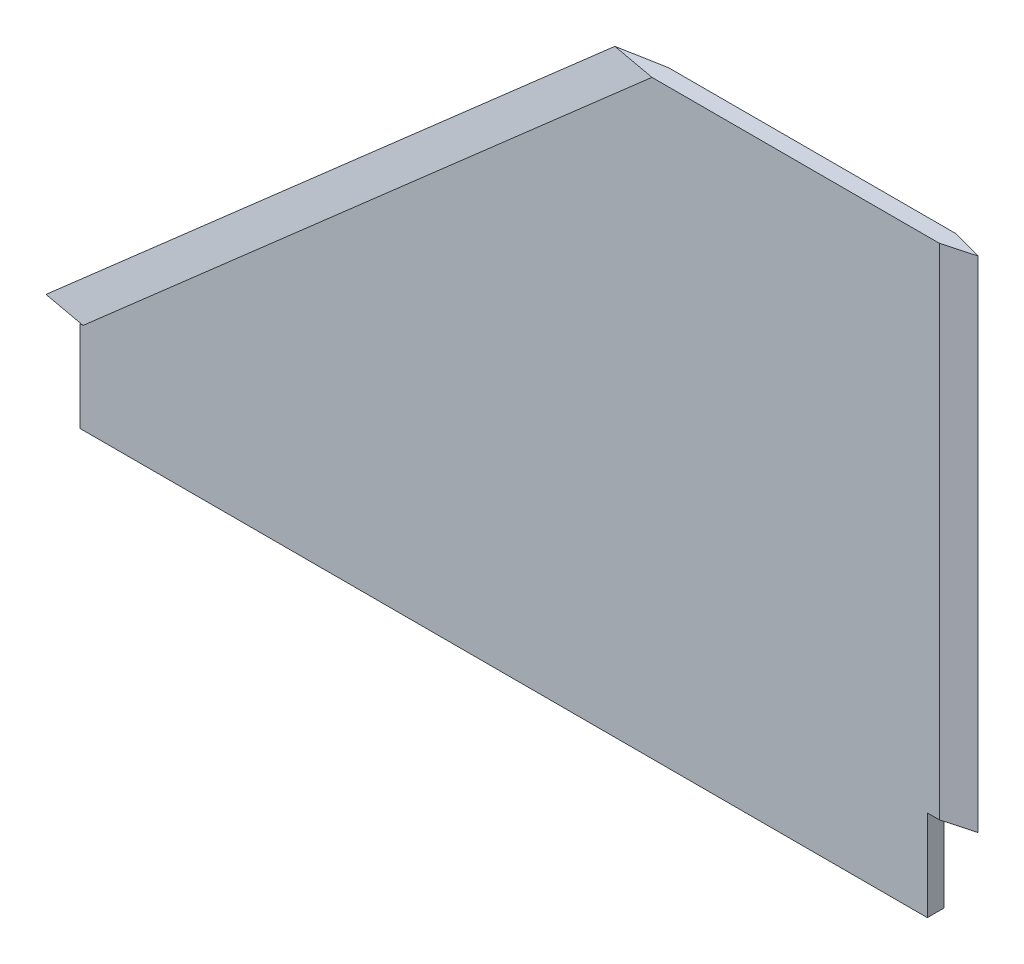
ISO-10303-21;
HEADER;
FILE_DESCRIPTION(('STEP AP214'),'2;1');
FILE_NAME('part.step','',(''),(''),'','','');
FILE_SCHEMA(('AUTOMOTIVE_DESIGN { 1 0 10303 214 1 1 1 1 }'));
ENDSEC;
DATA;
#1=APPLICATION_CONTEXT('core data for automotive mechanical design processes');
#2=APPLICATION_PROTOCOL_DEFINITION('international standard','automotive_design',2000,#1);
#3=PRODUCT_CONTEXT('',#1,'mechanical');
#4=PRODUCT('Part','Part','',(#3));
#5=PRODUCT_RELATED_PRODUCT_CATEGORY('part','',(#4));
#6=PRODUCT_DEFINITION_FORMATION('','',#4);
#7=PRODUCT_DEFINITION_CONTEXT('part definition',#1,'design');
#8=PRODUCT_DEFINITION('design','',#6,#7);
#9=PRODUCT_DEFINITION_SHAPE('','',#8);
#10=(LENGTH_UNIT() NAMED_UNIT(*) SI_UNIT(.MILLI.,.METRE.));
#11=(NAMED_UNIT(*) PLANE_ANGLE_UNIT() SI_UNIT($,.RADIAN.));
#12=(NAMED_UNIT(*) SI_UNIT($,.STERADIAN.) SOLID_ANGLE_UNIT());
#13=UNCERTAINTY_MEASURE_WITH_UNIT(LENGTH_MEASURE(1.E-05),#10,'distance_accuracy_value','');
#14=(GEOMETRIC_REPRESENTATION_CONTEXT(3) GLOBAL_UNCERTAINTY_ASSIGNED_CONTEXT((#13)) GLOBAL_UNIT_ASSIGNED_CONTEXT((#10,
#11,#12)) REPRESENTATION_CONTEXT('',''));
#15=CARTESIAN_POINT('',(0.,0.,0.));
#16=DIRECTION('',(0.,0.,1.));
#17=DIRECTION('',(1.,0.,0.));
#18=AXIS2_PLACEMENT_3D('',#15,#16,#17);
#19=CARTESIAN_POINT('',(0.,165.,-2.75));
#20=DIRECTION('',(0.,-1.,0.));
#21=DIRECTION('',(0.,0.,-1.));
#22=AXIS2_PLACEMENT_3D('',#19,#20,#21);
#23=PLANE('',#22);
#24=DIRECTION('',(-0.964205392803791,0.,-0.265156483021042));
#25=VECTOR('',#24,1.);
#26=CARTESIAN_POINT('',(10.8274259151657,165.,-39.3724578733294));
#27=LINE('',#26,#25);
#28=CARTESIAN_POINT('',(154.,165.,0.));
#29=VERTEX_POINT('',#28);
#30=CARTESIAN_POINT('',(144.,165.,-2.75));
#31=VERTEX_POINT('',#30);
#32=EDGE_CURVE('E141',#29,#31,#27,.T.);
#33=ORIENTED_EDGE('',*,*,#32,.T.);
#34=DIRECTION('',(1.,0.,0.));
#35=VECTOR('',#34,1.);
#36=CARTESIAN_POINT('',(0.,165.,-2.75));
#37=LINE('',#36,#35);
#38=CARTESIAN_POINT('',(49.,165.,-2.75));
#39=VERTEX_POINT('',#38);
#40=EDGE_CURVE('E153',#39,#31,#37,.T.);
#41=ORIENTED_EDGE('',*,*,#40,.F.);
#42=DIRECTION('',(-0.983606557377049,0.,0.180327868852459));
#43=VECTOR('',#42,1.);
#44=CARTESIAN_POINT('',(1.10561676968568,165.,6.03063692555762));
#45=LINE('',#44,#43);
#46=CARTESIAN_POINT('',(34.,165.,0.));
#47=VERTEX_POINT('',#46);
#48=EDGE_CURVE('E238',#39,#47,#45,.T.);
#49=ORIENTED_EDGE('',*,*,#48,.T.);
#50=DIRECTION('',(0.983606557377049,0.,0.180327868852459));
#51=VECTOR('',#50,1.);
#52=CARTESIAN_POINT('',(1.10561676968568,165.,-6.03063692555763));
#53=LINE('',#52,#51);
#54=CARTESIAN_POINT('',(49.,165.,2.75));
#55=VERTEX_POINT('',#54);
#56=EDGE_CURVE('E245',#47,#55,#53,.T.);
#57=ORIENTED_EDGE('',*,*,#56,.T.);
#58=DIRECTION('',(1.,0.,0.));
#59=VECTOR('',#58,1.);
#60=CARTESIAN_POINT('',(0.,165.,2.75));
#61=LINE('',#60,#59);
#62=CARTESIAN_POINT('',(144.,165.,2.75));
#63=VERTEX_POINT('',#62);
#64=EDGE_CURVE('E221',#55,#63,#61,.T.);
#65=ORIENTED_EDGE('',*,*,#64,.T.);
#66=DIRECTION('',(0.964205392803791,0.,-0.265156483021042));
#67=VECTOR('',#66,1.);
#68=CARTESIAN_POINT('',(10.8274259151657,165.,39.3724578733293));
#69=LINE('',#68,#67);
#70=EDGE_CURVE('E155',#63,#29,#69,.T.);
#71=ORIENTED_EDGE('',*,*,#70,.T.);
#72=EDGE_LOOP('',(#33,#41,#49,#57,#65,#71));
#73=FACE_BOUND('',#72,.T.);
#74=ADVANCED_FACE('F56',(#73),#23,.F.);
#75=CARTESIAN_POINT('',(0.,0.,-2.75));
#76=DIRECTION('',(0.,1.,0.));
#77=DIRECTION('',(0.,0.,1.));
#78=AXIS2_PLACEMENT_3D('',#75,#76,#77);
#79=PLANE('',#78);
#80=DIRECTION('',(0.96420539280379,0.,0.265156483021042));
#81=VECTOR('',#80,1.);
#82=CARTESIAN_POINT('',(10.8274259151655,1.94289029309402E-13,-39.3724578733294));
#83=LINE('',#82,#81);
#84=CARTESIAN_POINT('',(144.,0.,-2.75));
#85=VERTEX_POINT('',#84);
#86=CARTESIAN_POINT('',(154.,2.63677968348475E-13,0.));
#87=VERTEX_POINT('',#86);
#88=EDGE_CURVE('E144',#85,#87,#83,.T.);
#89=ORIENTED_EDGE('',*,*,#88,.T.);
#90=DIRECTION('',(-0.96420539280379,0.,0.265156483021042));
#91=VECTOR('',#90,1.);
#92=CARTESIAN_POINT('',(10.8274259151655,1.66533453693773E-13,39.3724578733293));
#93=LINE('',#92,#91);
#94=CARTESIAN_POINT('',(144.,0.,2.75));
#95=VERTEX_POINT('',#94);
#96=EDGE_CURVE('E240',#87,#95,#93,.T.);
#97=ORIENTED_EDGE('',*,*,#96,.T.);
#98=DIRECTION('',(-1.,0.,0.));
#99=VECTOR('',#98,1.);
#100=CARTESIAN_POINT('',(0.,0.,2.75));
#101=LINE('',#100,#99);
#102=CARTESIAN_POINT('',(140.,0.,2.74999999999999));
#103=VERTEX_POINT('',#102);
#104=EDGE_CURVE('E215',#95,#103,#101,.T.);
#105=ORIENTED_EDGE('',*,*,#104,.T.);
#106=DIRECTION('',(0.,0.,1.));
#107=VECTOR('',#106,1.);
#108=CARTESIAN_POINT('',(140.,0.,-2.75));
#109=LINE('',#108,#107);
#110=CARTESIAN_POINT('',(140.,0.,-2.75));
#111=VERTEX_POINT('',#110);
#112=EDGE_CURVE('E174',#111,#103,#109,.T.);
#113=ORIENTED_EDGE('',*,*,#112,.F.);
#114=DIRECTION('',(-1.,0.,0.));
#115=VECTOR('',#114,1.);
#116=CARTESIAN_POINT('',(0.,0.,-2.75));
#117=LINE('',#116,#115);
#118=EDGE_CURVE('E163',#85,#111,#117,.T.);
#119=ORIENTED_EDGE('',*,*,#118,.F.);
#120=EDGE_LOOP('',(#89,#97,#105,#113,#119));
#121=FACE_BOUND('',#120,.T.);
#122=ADVANCED_FACE('F258',(#121),#79,.F.);
#123=CARTESIAN_POINT('',(0.,0.,-2.75));
#124=DIRECTION('',(0.,0.,1.));
#125=DIRECTION('',(1.,0.,0.));
#126=AXIS2_PLACEMENT_3D('',#123,#124,#125);
#127=PLANE('',#126);
#128=DIRECTION('',(0.,1.,0.));
#129=VECTOR('',#128,1.);
#130=CARTESIAN_POINT('',(143.999999999998,-10.3712342563457,-2.75));
#131=LINE('',#130,#129);
#132=EDGE_CURVE('E138',#85,#31,#131,.T.);
#133=ORIENTED_EDGE('',*,*,#132,.F.);
#134=ORIENTED_EDGE('',*,*,#118,.T.);
#135=DIRECTION('',(0.,1.,0.));
#136=VECTOR('',#135,1.);
#137=CARTESIAN_POINT('',(140.,0.,-2.75));
#138=LINE('',#137,#136);
#139=CARTESIAN_POINT('',(140.,-30.,-2.75));
#140=VERTEX_POINT('',#139);
#141=EDGE_CURVE('E168',#140,#111,#138,.T.);
#142=ORIENTED_EDGE('',*,*,#141,.F.);
#143=DIRECTION('',(1.,0.,0.));
#144=VECTOR('',#143,1.);
#145=CARTESIAN_POINT('',(0.,-30.,-2.75));
#146=LINE('',#145,#144);
#147=CARTESIAN_POINT('',(-140.000000000001,-30.,-2.75));
#148=VERTEX_POINT('',#147);
#149=EDGE_CURVE('E166',#148,#140,#146,.T.);
#150=ORIENTED_EDGE('',*,*,#149,.F.);
#151=DIRECTION('',(0.,1.,0.));
#152=VECTOR('',#151,1.);
#153=CARTESIAN_POINT('',(-140.000000000001,0.,-2.75));
#154=LINE('',#153,#152);
#155=CARTESIAN_POINT('',(-140.000000000001,0.,-2.75));
#156=VERTEX_POINT('',#155);
#157=EDGE_CURVE('E162',#148,#156,#154,.T.);
#158=ORIENTED_EDGE('',*,*,#157,.T.);
#159=DIRECTION('',(-1.,0.,0.));
#160=VECTOR('',#159,1.);
#161=CARTESIAN_POINT('',(0.,0.,-2.75));
#162=LINE('',#161,#160);
#163=CARTESIAN_POINT('',(-139.000000000001,0.,-2.75));
#164=VERTEX_POINT('',#163);
#165=EDGE_CURVE('E12',#164,#156,#162,.T.);
#166=ORIENTED_EDGE('',*,*,#165,.F.);
#167=DIRECTION('',(0.751585239390208,0.659635981379703,0.));
#168=VECTOR('',#167,1.);
#169=CARTESIAN_POINT('',(-153.41871623823,-12.6547243580201,-2.75));
#170=LINE('',#169,#168);
#171=EDGE_CURVE('E161',#164,#39,#170,.T.);
#172=ORIENTED_EDGE('',*,*,#171,.T.);
#173=ORIENTED_EDGE('',*,*,#40,.T.);
#174=EDGE_LOOP('',(#133,#134,#142,#150,#158,#166,#172,#173));
#175=FACE_BOUND('',#174,.T.);
#176=ADVANCED_FACE('F158',(#175),#127,.F.);
#177=CARTESIAN_POINT('',(0.,0.,2.75));
#178=DIRECTION('',(0.,0.,1.));
#179=DIRECTION('',(1.,0.,0.));
#180=AXIS2_PLACEMENT_3D('',#177,#178,#179);
#181=PLANE('',#180);
#182=ORIENTED_EDGE('',*,*,#104,.F.);
#183=DIRECTION('',(0.,1.,0.));
#184=VECTOR('',#183,1.);
#185=CARTESIAN_POINT('',(143.999999999998,-10.3712342563458,2.75));
#186=LINE('',#185,#184);
#187=EDGE_CURVE('E71',#95,#63,#186,.T.);
#188=ORIENTED_EDGE('',*,*,#187,.T.);
#189=ORIENTED_EDGE('',*,*,#64,.F.);
#190=DIRECTION('',(0.751585239390208,0.659635981379703,0.));
#191=VECTOR('',#190,1.);
#192=CARTESIAN_POINT('',(-153.41871623823,-12.6547243580201,2.75));
#193=LINE('',#192,#191);
#194=CARTESIAN_POINT('',(-139.000000000001,0.,2.75));
#195=VERTEX_POINT('',#194);
#196=EDGE_CURVE('E243',#195,#55,#193,.T.);
#197=ORIENTED_EDGE('',*,*,#196,.F.);
#198=DIRECTION('',(-1.,0.,0.));
#199=VECTOR('',#198,1.);
#200=CARTESIAN_POINT('',(-202.41871623823,0.,2.75));
#201=LINE('',#200,#199);
#202=CARTESIAN_POINT('',(-140.000000000001,0.,2.75));
#203=VERTEX_POINT('',#202);
#204=EDGE_CURVE('E202',#195,#203,#201,.T.);
#205=ORIENTED_EDGE('',*,*,#204,.T.);
#206=DIRECTION('',(0.,1.,0.));
#207=VECTOR('',#206,1.);
#208=CARTESIAN_POINT('',(-140.000000000001,0.,2.75));
#209=LINE('',#208,#207);
#210=CARTESIAN_POINT('',(-140.000000000001,-30.,2.75));
#211=VERTEX_POINT('',#210);
#212=EDGE_CURVE('E212',#211,#203,#209,.T.);
#213=ORIENTED_EDGE('',*,*,#212,.F.);
#214=DIRECTION('',(1.,0.,0.));
#215=VECTOR('',#214,1.);
#216=CARTESIAN_POINT('',(0.,-30.,2.75));
#217=LINE('',#216,#215);
#218=CARTESIAN_POINT('',(140.,-30.,2.75));
#219=VERTEX_POINT('',#218);
#220=EDGE_CURVE('E224',#211,#219,#217,.T.);
#221=ORIENTED_EDGE('',*,*,#220,.T.);
#222=DIRECTION('',(0.,1.,0.));
#223=VECTOR('',#222,1.);
#224=CARTESIAN_POINT('',(140.,0.,2.74999999999999));
#225=LINE('',#224,#223);
#226=EDGE_CURVE('E213',#219,#103,#225,.T.);
#227=ORIENTED_EDGE('',*,*,#226,.T.);
#228=EDGE_LOOP('',(#182,#188,#189,#197,#205,#213,#221,#227));
#229=FACE_BOUND('',#228,.T.);
#230=ADVANCED_FACE('F250',(#229),#181,.T.);
#231=DIRECTION('',(0.983606557377049,0.,-0.180327868852459));
#232=VECTOR('',#231,1.);
#233=CARTESIAN_POINT('',(-200.844229631182,0.,8.58810876571651));
#234=LINE('',#233,#232);
#235=CARTESIAN_POINT('',(-154.000000000001,0.,0.));
#236=VERTEX_POINT('',#235);
#237=CARTESIAN_POINT('',(-140.000000000001,0.,-2.56666666666666));
#238=VERTEX_POINT('',#237);
#239=EDGE_CURVE('E190',#236,#238,#234,.T.);
#240=ORIENTED_EDGE('',*,*,#239,.T.);
#241=DIRECTION('',(0.,0.,1.));
#242=VECTOR('',#241,1.);
#243=CARTESIAN_POINT('',(-140.000000000001,0.,-2.75));
#244=LINE('',#243,#242);
#245=CARTESIAN_POINT('',(-140.000000000001,0.,2.56666666666667));
#246=VERTEX_POINT('',#245);
#247=EDGE_CURVE('E179',#238,#246,#244,.T.);
#248=ORIENTED_EDGE('',*,*,#247,.T.);
#249=DIRECTION('',(-0.983606557377049,0.,-0.180327868852459));
#250=VECTOR('',#249,1.);
#251=CARTESIAN_POINT('',(-200.844229631182,0.,-8.58810876571651));
#252=LINE('',#251,#250);
#253=EDGE_CURVE('E189',#246,#236,#252,.T.);
#254=ORIENTED_EDGE('',*,*,#253,.T.);
#255=EDGE_LOOP('',(#240,#248,#254));
#256=FACE_BOUND('',#255,.T.);
#257=ADVANCED_FACE('F188',(#256),#79,.F.);
#258=CARTESIAN_POINT('',(140.,0.,-2.75));
#259=DIRECTION('',(1.,0.,0.));
#260=DIRECTION('',(0.,0.,-1.));
#261=AXIS2_PLACEMENT_3D('',#258,#259,#260);
#262=PLANE('',#261);
#263=ORIENTED_EDGE('',*,*,#112,.T.);
#264=ORIENTED_EDGE('',*,*,#226,.F.);
#265=DIRECTION('',(0.,0.,1.));
#266=VECTOR('',#265,1.);
#267=CARTESIAN_POINT('',(140.,-30.,-2.75));
#268=LINE('',#267,#266);
#269=EDGE_CURVE('E64',#140,#219,#268,.T.);
#270=ORIENTED_EDGE('',*,*,#269,.F.);
#271=ORIENTED_EDGE('',*,*,#141,.T.);
#272=EDGE_LOOP('',(#263,#264,#270,#271));
#273=FACE_BOUND('',#272,.T.);
#274=ADVANCED_FACE('F58',(#273),#262,.T.);
#275=CARTESIAN_POINT('',(0.,-30.,-2.75));
#276=DIRECTION('',(0.,-1.,0.));
#277=DIRECTION('',(0.,0.,-1.));
#278=AXIS2_PLACEMENT_3D('',#275,#276,#277);
#279=PLANE('',#278);
#280=ORIENTED_EDGE('',*,*,#269,.T.);
#281=ORIENTED_EDGE('',*,*,#220,.F.);
#282=DIRECTION('',(0.,0.,1.));
#283=VECTOR('',#282,1.);
#284=CARTESIAN_POINT('',(-140.000000000001,-30.,-2.75));
#285=LINE('',#284,#283);
#286=EDGE_CURVE('E176',#148,#211,#285,.T.);
#287=ORIENTED_EDGE('',*,*,#286,.F.);
#288=ORIENTED_EDGE('',*,*,#149,.T.);
#289=EDGE_LOOP('',(#280,#281,#287,#288));
#290=FACE_BOUND('',#289,.T.);
#291=ADVANCED_FACE('F228',(#290),#279,.T.);
#292=CARTESIAN_POINT('',(-140.000000000001,0.,-2.75));
#293=DIRECTION('',(1.,0.,0.));
#294=DIRECTION('',(0.,0.,-1.));
#295=AXIS2_PLACEMENT_3D('',#292,#293,#294);
#296=PLANE('',#295);
#297=ORIENTED_EDGE('',*,*,#286,.T.);
#298=ORIENTED_EDGE('',*,*,#212,.T.);
#299=DIRECTION('',(0.,0.,1.));
#300=VECTOR('',#299,1.);
#301=CARTESIAN_POINT('',(-140.000000000001,0.,-2.75));
#302=LINE('',#301,#300);
#303=EDGE_CURVE('E206',#246,#203,#302,.T.);
#304=ORIENTED_EDGE('',*,*,#303,.F.);
#305=ORIENTED_EDGE('',*,*,#247,.F.);
#306=EDGE_CURVE('E178',#156,#238,#244,.T.);
#307=ORIENTED_EDGE('',*,*,#306,.F.);
#308=ORIENTED_EDGE('',*,*,#157,.F.);
#309=EDGE_LOOP('',(#297,#298,#304,#305,#307,#308));
#310=FACE_BOUND('',#309,.T.);
#311=ADVANCED_FACE('F210',(#310),#296,.F.);
#312=CARTESIAN_POINT('',(0.,0.,-2.75));
#313=DIRECTION('',(0.,1.,0.));
#314=DIRECTION('',(0.,0.,1.));
#315=AXIS2_PLACEMENT_3D('',#312,#313,#314);
#316=PLANE('',#315);
#317=ORIENTED_EDGE('',*,*,#303,.T.);
#318=ORIENTED_EDGE('',*,*,#204,.F.);
#319=EDGE_CURVE('E198',#195,#246,#252,.T.);
#320=ORIENTED_EDGE('',*,*,#319,.T.);
#321=EDGE_LOOP('',(#317,#318,#320));
#322=FACE_BOUND('',#321,.T.);
#323=ADVANCED_FACE('F205',(#322),#316,.T.);
#324=CARTESIAN_POINT('',(-201.313099468544,-12.6547243580199,-6.03063692555762));
#325=DIRECTION('',(-0.176637965698435,0.201260227583671,0.963479812900555));
#326=DIRECTION('',(0.,-0.978871698447465,0.20447542145347));
#327=AXIS2_PLACEMENT_3D('',#324,#325,#326);
#328=PLANE('',#327);
#329=ORIENTED_EDGE('',*,*,#196,.T.);
#330=ORIENTED_EDGE('',*,*,#56,.F.);
#331=DIRECTION('',(0.751585239390208,0.659635981379703,0.));
#332=VECTOR('',#331,1.);
#333=CARTESIAN_POINT('',(-168.41871623823,-12.6547243580202,0.));
#334=LINE('',#333,#332);
#335=EDGE_CURVE('E201',#236,#47,#334,.T.);
#336=ORIENTED_EDGE('',*,*,#335,.F.);
#337=ORIENTED_EDGE('',*,*,#253,.F.);
#338=ORIENTED_EDGE('',*,*,#319,.F.);
#339=EDGE_LOOP('',(#329,#330,#336,#337,#338));
#340=FACE_BOUND('',#339,.T.);
#341=ADVANCED_FACE('F197',(#340),#328,.T.);
#342=CARTESIAN_POINT('',(0.,0.,-2.75));
#343=DIRECTION('',(0.,1.,0.));
#344=DIRECTION('',(0.,0.,1.));
#345=AXIS2_PLACEMENT_3D('',#342,#343,#344);
#346=PLANE('',#345);
#347=ORIENTED_EDGE('',*,*,#306,.T.);
#348=EDGE_CURVE('E234',#238,#164,#234,.T.);
#349=ORIENTED_EDGE('',*,*,#348,.T.);
#350=ORIENTED_EDGE('',*,*,#165,.T.);
#351=EDGE_LOOP('',(#347,#349,#350));
#352=FACE_BOUND('',#351,.T.);
#353=ADVANCED_FACE('F232',(#352),#346,.T.);
#354=CARTESIAN_POINT('',(-201.313099468544,-12.65472435802,6.03063692555763));
#355=DIRECTION('',(-0.176637965698435,0.201260227583671,-0.963479812900554));
#356=DIRECTION('',(0.,0.978871698447465,0.20447542145347));
#357=AXIS2_PLACEMENT_3D('',#354,#355,#356);
#358=PLANE('',#357);
#359=ORIENTED_EDGE('',*,*,#335,.T.);
#360=ORIENTED_EDGE('',*,*,#48,.F.);
#361=ORIENTED_EDGE('',*,*,#171,.F.);
#362=ORIENTED_EDGE('',*,*,#348,.F.);
#363=ORIENTED_EDGE('',*,*,#239,.F.);
#364=EDGE_LOOP('',(#359,#360,#361,#362,#363));
#365=FACE_BOUND('',#364,.T.);
#366=ADVANCED_FACE('F237',(#365),#358,.T.);
#367=CARTESIAN_POINT('',(10.8274259151635,-10.3712342563455,39.3724578733293));
#368=DIRECTION('',(0.265156483021042,0.,0.96420539280379));
#369=DIRECTION('',(0.96420539280379,0.,-0.265156483021042));
#370=AXIS2_PLACEMENT_3D('',#367,#368,#369);
#371=PLANE('',#370);
#372=DIRECTION('',(0.,1.,0.));
#373=VECTOR('',#372,1.);
#374=CARTESIAN_POINT('',(153.999999999998,-10.3712342563456,0.));
#375=LINE('',#374,#373);
#376=EDGE_CURVE('E251',#87,#29,#375,.T.);
#377=ORIENTED_EDGE('',*,*,#376,.T.);
#378=ORIENTED_EDGE('',*,*,#70,.F.);
#379=ORIENTED_EDGE('',*,*,#187,.F.);
#380=ORIENTED_EDGE('',*,*,#96,.F.);
#381=EDGE_LOOP('',(#377,#378,#379,#380));
#382=FACE_BOUND('',#381,.T.);
#383=ADVANCED_FACE('F259',(#382),#371,.T.);
#384=CARTESIAN_POINT('',(10.8274259151635,-10.3712342563455,-39.3724578733294));
#385=DIRECTION('',(0.265156483021042,0.,-0.96420539280379));
#386=DIRECTION('',(-0.96420539280379,0.,-0.265156483021042));
#387=AXIS2_PLACEMENT_3D('',#384,#385,#386);
#388=PLANE('',#387);
#389=ORIENTED_EDGE('',*,*,#132,.T.);
#390=ORIENTED_EDGE('',*,*,#32,.F.);
#391=ORIENTED_EDGE('',*,*,#376,.F.);
#392=ORIENTED_EDGE('',*,*,#88,.F.);
#393=EDGE_LOOP('',(#389,#390,#391,#392));
#394=FACE_BOUND('',#393,.T.);
#395=ADVANCED_FACE('F140',(#394),#388,.T.);
#396=CLOSED_SHELL('',(#74,#122,#176,#230,#257,#274,#291,#311,#323,#341,#353,#366,#383,#395));
#397=MANIFOLD_SOLID_BREP('B2',#396);
#398=ADVANCED_BREP_SHAPE_REPRESENTATION('',(#18,#397),#14);
#399=SHAPE_DEFINITION_REPRESENTATION(#9,#398);
ENDSEC;
END-ISO-10303-21;
